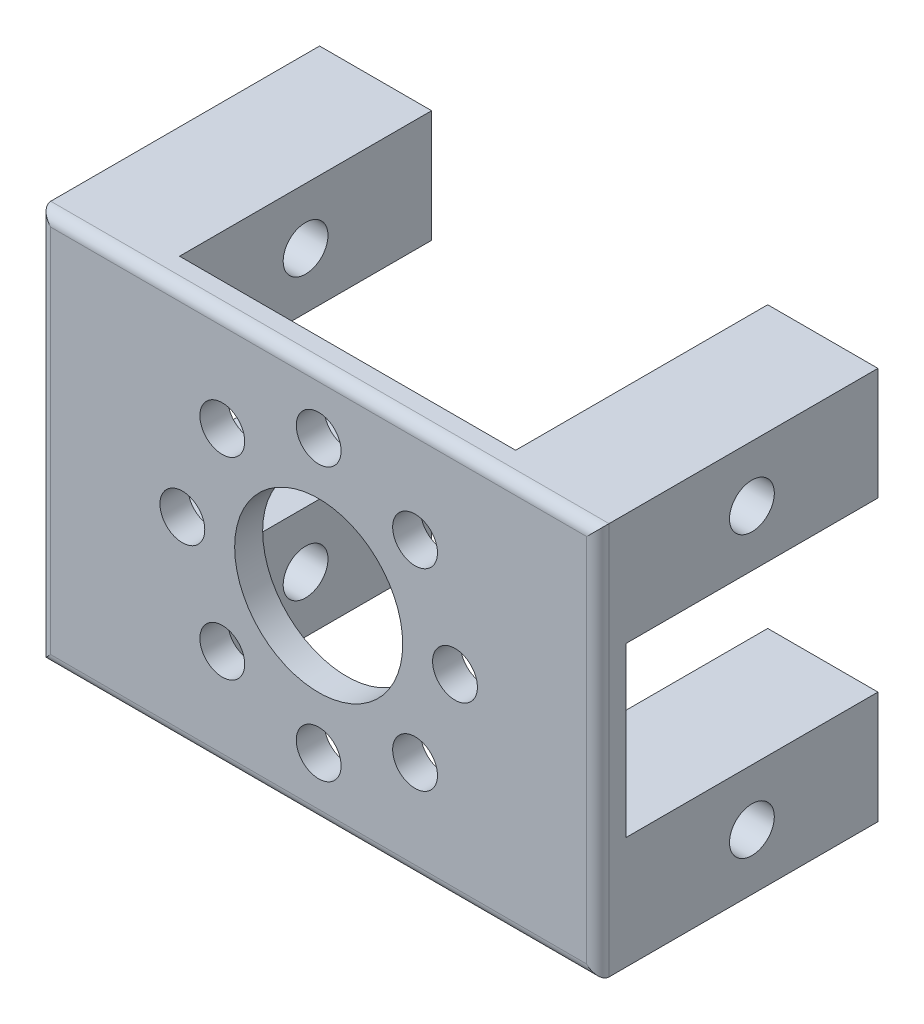
ISO-10303-21;
HEADER;
FILE_DESCRIPTION(('STEP AP214'),'2;1');
FILE_NAME('part.step','',(''),(''),'','','');
FILE_SCHEMA(('AUTOMOTIVE_DESIGN { 1 0 10303 214 1 1 1 1 }'));
ENDSEC;
DATA;
#1=APPLICATION_CONTEXT('core data for automotive mechanical design processes');
#2=APPLICATION_PROTOCOL_DEFINITION('international standard','automotive_design',2000,#1);
#3=PRODUCT_CONTEXT('',#1,'mechanical');
#4=PRODUCT('Part','Part','',(#3));
#5=PRODUCT_RELATED_PRODUCT_CATEGORY('part','',(#4));
#6=PRODUCT_DEFINITION_FORMATION('','',#4);
#7=PRODUCT_DEFINITION_CONTEXT('part definition',#1,'design');
#8=PRODUCT_DEFINITION('design','',#6,#7);
#9=PRODUCT_DEFINITION_SHAPE('','',#8);
#10=(LENGTH_UNIT() NAMED_UNIT(*) SI_UNIT(.MILLI.,.METRE.));
#11=(NAMED_UNIT(*) PLANE_ANGLE_UNIT() SI_UNIT($,.RADIAN.));
#12=(NAMED_UNIT(*) SI_UNIT($,.STERADIAN.) SOLID_ANGLE_UNIT());
#13=UNCERTAINTY_MEASURE_WITH_UNIT(LENGTH_MEASURE(1.E-05),#10,'distance_accuracy_value','');
#14=(GEOMETRIC_REPRESENTATION_CONTEXT(3) GLOBAL_UNCERTAINTY_ASSIGNED_CONTEXT((#13)) GLOBAL_UNIT_ASSIGNED_CONTEXT((#10,
#11,#12)) REPRESENTATION_CONTEXT('',''));
#15=CARTESIAN_POINT('',(0.,0.,0.));
#16=DIRECTION('',(0.,0.,1.));
#17=DIRECTION('',(1.,0.,0.));
#18=AXIS2_PLACEMENT_3D('',#15,#16,#17);
#19=CARTESIAN_POINT('',(0.,0.,0.));
#20=DIRECTION('',(0.,0.,-1.));
#21=DIRECTION('',(-1.,0.,0.));
#22=AXIS2_PLACEMENT_3D('',#19,#20,#21);
#23=PLANE('',#22);
#24=DIRECTION('',(1.,0.,0.));
#25=VECTOR('',#24,1.);
#26=CARTESIAN_POINT('',(-49.8392242774798,-15.,0.));
#27=LINE('',#26,#25);
#28=CARTESIAN_POINT('',(30.1607757225202,-15.,0.));
#29=VERTEX_POINT('',#28);
#30=CARTESIAN_POINT('',(49.8392242774798,-15.,0.));
#31=VERTEX_POINT('',#30);
#32=EDGE_CURVE('E168',#29,#31,#27,.T.);
#33=ORIENTED_EDGE('',*,*,#32,.T.);
#34=DIRECTION('',(0.,1.,0.));
#35=VECTOR('',#34,1.);
#36=CARTESIAN_POINT('',(49.8392242774798,-35.0450845481055,0.));
#37=LINE('',#36,#35);
#38=CARTESIAN_POINT('',(49.8392242774798,-35.0450845481055,0.));
#39=VERTEX_POINT('',#38);
#40=EDGE_CURVE('E184',#39,#31,#37,.T.);
#41=ORIENTED_EDGE('',*,*,#40,.F.);
#42=DIRECTION('',(1.,0.,0.));
#43=VECTOR('',#42,1.);
#44=CARTESIAN_POINT('',(-49.8392242774798,-35.0450845481055,0.));
#45=LINE('',#44,#43);
#46=CARTESIAN_POINT('',(30.1607757225202,-35.0450845481055,0.));
#47=VERTEX_POINT('',#46);
#48=EDGE_CURVE('E216',#47,#39,#45,.T.);
#49=ORIENTED_EDGE('',*,*,#48,.F.);
#50=DIRECTION('',(0.,1.,0.));
#51=VECTOR('',#50,1.);
#52=CARTESIAN_POINT('',(30.1607757225202,-35.0450845481055,0.));
#53=LINE('',#52,#51);
#54=EDGE_CURVE('E185',#47,#29,#53,.T.);
#55=ORIENTED_EDGE('',*,*,#54,.T.);
#56=EDGE_LOOP('',(#33,#41,#49,#55));
#57=FACE_BOUND('',#56,.T.);
#58=ADVANCED_FACE('F39',(#57),#23,.T.);
#59=CARTESIAN_POINT('',(-49.8392242774798,-15.,0.));
#60=VERTEX_POINT('',#59);
#61=CARTESIAN_POINT('',(-29.8392242774798,-15.,0.));
#62=VERTEX_POINT('',#61);
#63=EDGE_CURVE('E187',#60,#62,#27,.T.);
#64=ORIENTED_EDGE('',*,*,#63,.T.);
#65=DIRECTION('',(0.,1.,0.));
#66=VECTOR('',#65,1.);
#67=CARTESIAN_POINT('',(-29.8392242774798,-35.0450845481055,0.));
#68=LINE('',#67,#66);
#69=CARTESIAN_POINT('',(-29.8392242774798,-35.0450845481055,0.));
#70=VERTEX_POINT('',#69);
#71=EDGE_CURVE('E378',#70,#62,#68,.T.);
#72=ORIENTED_EDGE('',*,*,#71,.F.);
#73=CARTESIAN_POINT('',(-49.8392242774798,-35.0450845481055,0.));
#74=VERTEX_POINT('',#73);
#75=EDGE_CURVE('E217',#74,#70,#45,.T.);
#76=ORIENTED_EDGE('',*,*,#75,.F.);
#77=DIRECTION('',(0.,-1.,0.));
#78=VECTOR('',#77,1.);
#79=CARTESIAN_POINT('',(-49.8392242774798,-35.0450845481055,0.));
#80=LINE('',#79,#78);
#81=EDGE_CURVE('E211',#60,#74,#80,.T.);
#82=ORIENTED_EDGE('',*,*,#81,.F.);
#83=EDGE_LOOP('',(#64,#72,#76,#82));
#84=FACE_BOUND('',#83,.T.);
#85=ADVANCED_FACE('F499',(#84),#23,.T.);
#86=CARTESIAN_POINT('',(-29.8392242774798,-35.0450845481055,0.));
#87=DIRECTION('',(-1.,0.,0.));
#88=DIRECTION('',(0.,0.,1.));
#89=AXIS2_PLACEMENT_3D('',#86,#87,#88);
#90=PLANE('',#89);
#91=CARTESIAN_POINT('',(-29.8392242774798,-25.0225422740527,22.5));
#92=DIRECTION('',(-1.,0.,0.));
#93=DIRECTION('',(0.,0.,1.));
#94=AXIS2_PLACEMENT_3D('',#91,#92,#93);
#95=CIRCLE('',#94,4.);
#96=CARTESIAN_POINT('',(-29.8392242774798,-25.0225422740527,26.5));
#97=VERTEX_POINT('',#96);
#98=EDGE_CURVE('E178',#97,#97,#95,.T.);
#99=ORIENTED_EDGE('',*,*,#98,.T.);
#100=EDGE_LOOP('',(#99));
#101=FACE_BOUND('',#100,.T.);
#102=ORIENTED_EDGE('',*,*,#71,.T.);
#103=DIRECTION('',(0.,0.,1.));
#104=VECTOR('',#103,1.);
#105=CARTESIAN_POINT('',(-29.8392242774798,-15.,0.));
#106=LINE('',#105,#104);
#107=CARTESIAN_POINT('',(-29.8392242774798,-15.,45.));
#108=VERTEX_POINT('',#107);
#109=EDGE_CURVE('E346',#62,#108,#106,.T.);
#110=ORIENTED_EDGE('',*,*,#109,.T.);
#111=DIRECTION('',(0.,1.,0.));
#112=VECTOR('',#111,1.);
#113=CARTESIAN_POINT('',(-29.8392242774798,-35.0450845481055,45.));
#114=LINE('',#113,#112);
#115=CARTESIAN_POINT('',(-29.8392242774798,-35.0450845481055,45.));
#116=VERTEX_POINT('',#115);
#117=EDGE_CURVE('E238',#116,#108,#114,.T.);
#118=ORIENTED_EDGE('',*,*,#117,.F.);
#119=DIRECTION('',(0.,0.,1.));
#120=VECTOR('',#119,1.);
#121=CARTESIAN_POINT('',(-29.8392242774798,-35.0450845481055,0.));
#122=LINE('',#121,#120);
#123=EDGE_CURVE('E369',#70,#116,#122,.T.);
#124=ORIENTED_EDGE('',*,*,#123,.F.);
#125=EDGE_LOOP('',(#102,#110,#118,#124));
#126=FACE_BOUND('',#125,.T.);
#127=ADVANCED_FACE('F504',(#101,#126),#90,.F.);
#128=CARTESIAN_POINT('',(30.1607757225202,-35.0450845481055,0.));
#129=DIRECTION('',(-1.,0.,0.));
#130=DIRECTION('',(0.,0.,1.));
#131=AXIS2_PLACEMENT_3D('',#128,#129,#130);
#132=PLANE('',#131);
#133=CARTESIAN_POINT('',(30.1607757225202,-25.0225422740527,22.5));
#134=DIRECTION('',(-1.,0.,0.));
#135=DIRECTION('',(0.,0.,1.));
#136=AXIS2_PLACEMENT_3D('',#133,#134,#135);
#137=CIRCLE('',#136,4.);
#138=CARTESIAN_POINT('',(30.1607757225202,-25.0225422740527,26.5));
#139=VERTEX_POINT('',#138);
#140=EDGE_CURVE('E304',#139,#139,#137,.T.);
#141=ORIENTED_EDGE('',*,*,#140,.F.);
#142=EDGE_LOOP('',(#141));
#143=FACE_BOUND('',#142,.T.);
#144=DIRECTION('',(0.,0.,1.));
#145=VECTOR('',#144,1.);
#146=CARTESIAN_POINT('',(30.1607757225202,-15.,0.));
#147=LINE('',#146,#145);
#148=CARTESIAN_POINT('',(30.1607757225202,-15.,45.));
#149=VERTEX_POINT('',#148);
#150=EDGE_CURVE('E241',#29,#149,#147,.T.);
#151=ORIENTED_EDGE('',*,*,#150,.F.);
#152=ORIENTED_EDGE('',*,*,#54,.F.);
#153=DIRECTION('',(0.,0.,1.));
#154=VECTOR('',#153,1.);
#155=CARTESIAN_POINT('',(30.1607757225202,-35.0450845481055,0.));
#156=LINE('',#155,#154);
#157=CARTESIAN_POINT('',(30.1607757225202,-35.0450845481055,45.));
#158=VERTEX_POINT('',#157);
#159=EDGE_CURVE('E366',#47,#158,#156,.T.);
#160=ORIENTED_EDGE('',*,*,#159,.T.);
#161=DIRECTION('',(0.,1.,0.));
#162=VECTOR('',#161,1.);
#163=CARTESIAN_POINT('',(30.1607757225202,-35.0450845481055,45.));
#164=LINE('',#163,#162);
#165=EDGE_CURVE('E386',#158,#149,#164,.T.);
#166=ORIENTED_EDGE('',*,*,#165,.T.);
#167=EDGE_LOOP('',(#151,#152,#160,#166));
#168=FACE_BOUND('',#167,.T.);
#169=ADVANCED_FACE('F517',(#143,#168),#132,.T.);
#170=DIRECTION('',(1.,0.,0.));
#171=VECTOR('',#170,1.);
#172=CARTESIAN_POINT('',(-49.8392242774798,15.,0.));
#173=LINE('',#172,#171);
#174=CARTESIAN_POINT('',(30.1607757225202,15.,0.));
#175=VERTEX_POINT('',#174);
#176=CARTESIAN_POINT('',(49.8392242774798,15.,0.));
#177=VERTEX_POINT('',#176);
#178=EDGE_CURVE('E339',#175,#177,#173,.T.);
#179=ORIENTED_EDGE('',*,*,#178,.F.);
#180=CARTESIAN_POINT('',(30.1607757225202,35.0450845481055,0.));
#181=VERTEX_POINT('',#180);
#182=EDGE_CURVE('E385',#175,#181,#53,.T.);
#183=ORIENTED_EDGE('',*,*,#182,.T.);
#184=DIRECTION('',(-1.,0.,0.));
#185=VECTOR('',#184,1.);
#186=CARTESIAN_POINT('',(-49.8392242774798,35.0450845481055,0.));
#187=LINE('',#186,#185);
#188=CARTESIAN_POINT('',(49.8392242774798,35.0450845481055,0.));
#189=VERTEX_POINT('',#188);
#190=EDGE_CURVE('E202',#189,#181,#187,.T.);
#191=ORIENTED_EDGE('',*,*,#190,.F.);
#192=EDGE_CURVE('E197',#177,#189,#37,.T.);
#193=ORIENTED_EDGE('',*,*,#192,.F.);
#194=EDGE_LOOP('',(#179,#183,#191,#193));
#195=FACE_BOUND('',#194,.T.);
#196=ADVANCED_FACE('F463',(#195),#23,.T.);
#197=CARTESIAN_POINT('',(0.,0.,50.));
#198=DIRECTION('',(0.,0.,-1.));
#199=DIRECTION('',(-1.,0.,0.));
#200=AXIS2_PLACEMENT_3D('',#197,#198,#199);
#201=PLANE('',#200);
#202=DIRECTION('',(1.,0.,0.));
#203=VECTOR('',#202,1.);
#204=CARTESIAN_POINT('',(0.,-33.0450845481055,50.));
#205=LINE('',#204,#203);
#206=CARTESIAN_POINT('',(-47.8392242774798,-33.0450845481055,50.));
#207=VERTEX_POINT('',#206);
#208=CARTESIAN_POINT('',(47.8392242774798,-33.0450845481055,50.));
#209=VERTEX_POINT('',#208);
#210=EDGE_CURVE('E256',#207,#209,#205,.T.);
#211=ORIENTED_EDGE('',*,*,#210,.T.);
#212=DIRECTION('',(0.,1.,0.));
#213=VECTOR('',#212,1.);
#214=CARTESIAN_POINT('',(47.8392242774798,0.,50.));
#215=LINE('',#214,#213);
#216=CARTESIAN_POINT('',(47.8392242774798,33.0450845481055,50.));
#217=VERTEX_POINT('',#216);
#218=EDGE_CURVE('E259',#209,#217,#215,.T.);
#219=ORIENTED_EDGE('',*,*,#218,.T.);
#220=DIRECTION('',(-1.,0.,0.));
#221=VECTOR('',#220,1.);
#222=CARTESIAN_POINT('',(0.,33.0450845481055,50.));
#223=LINE('',#222,#221);
#224=CARTESIAN_POINT('',(-47.8392242774798,33.0450845481055,50.));
#225=VERTEX_POINT('',#224);
#226=EDGE_CURVE('E244',#217,#225,#223,.T.);
#227=ORIENTED_EDGE('',*,*,#226,.T.);
#228=DIRECTION('',(0.,-1.,0.));
#229=VECTOR('',#228,1.);
#230=CARTESIAN_POINT('',(-47.8392242774798,0.,50.));
#231=LINE('',#230,#229);
#232=EDGE_CURVE('E253',#225,#207,#231,.T.);
#233=ORIENTED_EDGE('',*,*,#232,.T.);
#234=EDGE_LOOP('',(#211,#219,#227,#233));
#235=FACE_BOUND('',#234,.T.);
#236=CARTESIAN_POINT('',(0.,0.,50.));
#237=DIRECTION('',(0.,0.,1.));
#238=DIRECTION('',(1.,0.,0.));
#239=AXIS2_PLACEMENT_3D('',#236,#237,#238);
#240=CIRCLE('',#239,15.);
#241=CARTESIAN_POINT('',(15.,0.,50.));
#242=VERTEX_POINT('',#241);
#243=EDGE_CURVE('E205',#242,#242,#240,.T.);
#244=ORIENTED_EDGE('',*,*,#243,.F.);
#245=EDGE_LOOP('',(#244));
#246=FACE_BOUND('',#245,.T.);
#247=CARTESIAN_POINT('',(24.3350700799044,0.,50.));
#248=DIRECTION('',(0.,0.,1.));
#249=DIRECTION('',(1.,0.,0.));
#250=AXIS2_PLACEMENT_3D('',#247,#248,#249);
#251=CIRCLE('',#250,4.);
#252=CARTESIAN_POINT('',(28.3350700799044,0.,50.));
#253=VERTEX_POINT('',#252);
#254=EDGE_CURVE('E448',#253,#253,#251,.T.);
#255=ORIENTED_EDGE('',*,*,#254,.F.);
#256=EDGE_LOOP('',(#255));
#257=FACE_BOUND('',#256,.T.);
#258=CARTESIAN_POINT('',(17.2074930741502,-17.2074930741503,50.));
#259=DIRECTION('',(0.,0.,1.));
#260=DIRECTION('',(1.,0.,0.));
#261=AXIS2_PLACEMENT_3D('',#258,#259,#260);
#262=CIRCLE('',#261,4.);
#263=CARTESIAN_POINT('',(21.2074930741502,-17.2074930741503,50.));
#264=VERTEX_POINT('',#263);
#265=EDGE_CURVE('E445',#264,#264,#262,.T.);
#266=ORIENTED_EDGE('',*,*,#265,.F.);
#267=EDGE_LOOP('',(#266));
#268=FACE_BOUND('',#267,.T.);
#269=CARTESIAN_POINT('',(0.,-24.3350700799044,50.));
#270=DIRECTION('',(0.,0.,1.));
#271=DIRECTION('',(1.,0.,0.));
#272=AXIS2_PLACEMENT_3D('',#269,#270,#271);
#273=CIRCLE('',#272,4.);
#274=CARTESIAN_POINT('',(3.99999999999991,-24.3350700799044,50.));
#275=VERTEX_POINT('',#274);
#276=EDGE_CURVE('E441',#275,#275,#273,.T.);
#277=ORIENTED_EDGE('',*,*,#276,.F.);
#278=EDGE_LOOP('',(#277));
#279=FACE_BOUND('',#278,.T.);
#280=CARTESIAN_POINT('',(-17.2074930741504,-17.2074930741502,50.));
#281=DIRECTION('',(0.,0.,1.));
#282=DIRECTION('',(1.,0.,0.));
#283=AXIS2_PLACEMENT_3D('',#280,#281,#282);
#284=CIRCLE('',#283,4.);
#285=CARTESIAN_POINT('',(-13.2074930741504,-17.2074930741502,50.));
#286=VERTEX_POINT('',#285);
#287=EDGE_CURVE('E437',#286,#286,#284,.T.);
#288=ORIENTED_EDGE('',*,*,#287,.F.);
#289=EDGE_LOOP('',(#288));
#290=FACE_BOUND('',#289,.T.);
#291=CARTESIAN_POINT('',(-24.3350700799044,1.7686978003076E-13,50.));
#292=DIRECTION('',(0.,0.,1.));
#293=DIRECTION('',(1.,0.,0.));
#294=AXIS2_PLACEMENT_3D('',#291,#292,#293);
#295=CIRCLE('',#294,4.);
#296=CARTESIAN_POINT('',(-20.3350700799044,1.7686978003076E-13,50.));
#297=VERTEX_POINT('',#296);
#298=EDGE_CURVE('E433',#297,#297,#295,.T.);
#299=ORIENTED_EDGE('',*,*,#298,.F.);
#300=EDGE_LOOP('',(#299));
#301=FACE_BOUND('',#300,.T.);
#302=CARTESIAN_POINT('',(-17.2074930741501,17.2074930741504,50.));
#303=DIRECTION('',(0.,0.,1.));
#304=DIRECTION('',(1.,0.,0.));
#305=AXIS2_PLACEMENT_3D('',#302,#303,#304);
#306=CIRCLE('',#305,4.);
#307=CARTESIAN_POINT('',(-13.2074930741501,17.2074930741504,50.));
#308=VERTEX_POINT('',#307);
#309=EDGE_CURVE('E429',#308,#308,#306,.T.);
#310=ORIENTED_EDGE('',*,*,#309,.F.);
#311=EDGE_LOOP('',(#310));
#312=FACE_BOUND('',#311,.T.);
#313=CARTESIAN_POINT('',(2.61835223094186E-13,24.3350700799044,50.));
#314=DIRECTION('',(0.,0.,1.));
#315=DIRECTION('',(1.,0.,0.));
#316=AXIS2_PLACEMENT_3D('',#313,#314,#315);
#317=CIRCLE('',#316,4.);
#318=CARTESIAN_POINT('',(4.00000000000026,24.3350700799044,50.));
#319=VERTEX_POINT('',#318);
#320=EDGE_CURVE('E425',#319,#319,#317,.T.);
#321=ORIENTED_EDGE('',*,*,#320,.F.);
#322=EDGE_LOOP('',(#321));
#323=FACE_BOUND('',#322,.T.);
#324=CARTESIAN_POINT('',(17.2074930741505,17.2074930741501,50.));
#325=DIRECTION('',(0.,0.,1.));
#326=DIRECTION('',(1.,0.,0.));
#327=AXIS2_PLACEMENT_3D('',#324,#325,#326);
#328=CIRCLE('',#327,4.);
#329=CARTESIAN_POINT('',(21.2074930741505,17.2074930741501,50.));
#330=VERTEX_POINT('',#329);
#331=EDGE_CURVE('E421',#330,#330,#328,.T.);
#332=ORIENTED_EDGE('',*,*,#331,.F.);
#333=EDGE_LOOP('',(#332));
#334=FACE_BOUND('',#333,.T.);
#335=ADVANCED_FACE('F459',(#235,#246,#257,#268,#279,#290,#301,#312,#323,#334),#201,.F.);
#336=CARTESIAN_POINT('',(-49.8392242774798,15.,0.));
#337=VERTEX_POINT('',#336);
#338=CARTESIAN_POINT('',(-29.8392242774798,15.,0.));
#339=VERTEX_POINT('',#338);
#340=EDGE_CURVE('E337',#337,#339,#173,.T.);
#341=ORIENTED_EDGE('',*,*,#340,.F.);
#342=CARTESIAN_POINT('',(-49.8392242774798,35.0450845481055,0.));
#343=VERTEX_POINT('',#342);
#344=EDGE_CURVE('E212',#343,#337,#80,.T.);
#345=ORIENTED_EDGE('',*,*,#344,.F.);
#346=CARTESIAN_POINT('',(-29.8392242774798,35.0450845481055,0.));
#347=VERTEX_POINT('',#346);
#348=EDGE_CURVE('E196',#347,#343,#187,.T.);
#349=ORIENTED_EDGE('',*,*,#348,.F.);
#350=EDGE_CURVE('E382',#339,#347,#68,.T.);
#351=ORIENTED_EDGE('',*,*,#350,.F.);
#352=EDGE_LOOP('',(#341,#345,#349,#351));
#353=FACE_BOUND('',#352,.T.);
#354=ADVANCED_FACE('F462',(#353),#23,.T.);
#355=CARTESIAN_POINT('',(49.8392242774798,-35.0450845481055,50.));
#356=DIRECTION('',(-1.,0.,0.));
#357=DIRECTION('',(0.,0.,1.));
#358=AXIS2_PLACEMENT_3D('',#355,#356,#357);
#359=PLANE('',#358);
#360=CARTESIAN_POINT('',(49.8392242774798,-25.0225422740527,22.5));
#361=DIRECTION('',(1.,0.,0.));
#362=DIRECTION('',(0.,0.,-1.));
#363=AXIS2_PLACEMENT_3D('',#360,#361,#362);
#364=CIRCLE('',#363,4.);
#365=CARTESIAN_POINT('',(49.8392242774798,-25.0225422740527,18.5));
#366=VERTEX_POINT('',#365);
#367=EDGE_CURVE('E296',#366,#366,#364,.T.);
#368=ORIENTED_EDGE('',*,*,#367,.F.);
#369=EDGE_LOOP('',(#368));
#370=FACE_BOUND('',#369,.T.);
#371=CARTESIAN_POINT('',(49.8392242774798,25.0225422740527,22.5));
#372=DIRECTION('',(1.,0.,0.));
#373=DIRECTION('',(0.,0.,1.));
#374=AXIS2_PLACEMENT_3D('',#371,#372,#373);
#375=CIRCLE('',#374,4.);
#376=CARTESIAN_POINT('',(49.8392242774798,25.0225422740527,26.5));
#377=VERTEX_POINT('',#376);
#378=EDGE_CURVE('E284',#377,#377,#375,.T.);
#379=ORIENTED_EDGE('',*,*,#378,.F.);
#380=EDGE_LOOP('',(#379));
#381=FACE_BOUND('',#380,.T.);
#382=DIRECTION('',(0.,0.,-1.));
#383=VECTOR('',#382,1.);
#384=CARTESIAN_POINT('',(49.8392242774798,35.0450845481055,50.));
#385=LINE('',#384,#383);
#386=CARTESIAN_POINT('',(49.8392242774798,35.0450845481055,48.));
#387=VERTEX_POINT('',#386);
#388=EDGE_CURVE('E229',#387,#189,#385,.T.);
#389=ORIENTED_EDGE('',*,*,#388,.F.);
#390=DIRECTION('',(0.,1.,0.));
#391=VECTOR('',#390,1.);
#392=CARTESIAN_POINT('',(49.8392242774798,-35.0450845481055,48.));
#393=LINE('',#392,#391);
#394=CARTESIAN_POINT('',(49.8392242774798,-35.0450845481055,48.));
#395=VERTEX_POINT('',#394);
#396=EDGE_CURVE('E263',#387,#395,#393,.F.);
#397=ORIENTED_EDGE('',*,*,#396,.T.);
#398=DIRECTION('',(0.,0.,-1.));
#399=VECTOR('',#398,1.);
#400=CARTESIAN_POINT('',(49.8392242774798,-35.0450845481055,50.));
#401=LINE('',#400,#399);
#402=EDGE_CURVE('E193',#395,#39,#401,.T.);
#403=ORIENTED_EDGE('',*,*,#402,.T.);
#404=ORIENTED_EDGE('',*,*,#40,.T.);
#405=DIRECTION('',(0.,0.,-1.));
#406=VECTOR('',#405,1.);
#407=CARTESIAN_POINT('',(49.8392242774798,-15.,45.));
#408=LINE('',#407,#406);
#409=CARTESIAN_POINT('',(49.8392242774798,-15.,45.));
#410=VERTEX_POINT('',#409);
#411=EDGE_CURVE('E165',#410,#31,#408,.T.);
#412=ORIENTED_EDGE('',*,*,#411,.F.);
#413=DIRECTION('',(0.,-1.,0.));
#414=VECTOR('',#413,1.);
#415=CARTESIAN_POINT('',(49.8392242774798,15.,45.));
#416=LINE('',#415,#414);
#417=CARTESIAN_POINT('',(49.8392242774798,15.,45.));
#418=VERTEX_POINT('',#417);
#419=EDGE_CURVE('E314',#418,#410,#416,.T.);
#420=ORIENTED_EDGE('',*,*,#419,.F.);
#421=DIRECTION('',(0.,0.,1.));
#422=VECTOR('',#421,1.);
#423=CARTESIAN_POINT('',(49.8392242774798,15.,0.));
#424=LINE('',#423,#422);
#425=EDGE_CURVE('E177',#177,#418,#424,.T.);
#426=ORIENTED_EDGE('',*,*,#425,.F.);
#427=ORIENTED_EDGE('',*,*,#192,.T.);
#428=EDGE_LOOP('',(#389,#397,#403,#404,#412,#420,#426,#427));
#429=FACE_BOUND('',#428,.T.);
#430=ADVANCED_FACE('F191',(#370,#381,#429),#359,.F.);
#431=CARTESIAN_POINT('',(-49.8392242774798,35.0450845481055,50.));
#432=DIRECTION('',(0.,-1.,0.));
#433=DIRECTION('',(0.,0.,-1.));
#434=AXIS2_PLACEMENT_3D('',#431,#432,#433);
#435=PLANE('',#434);
#436=DIRECTION('',(0.,0.,-1.));
#437=VECTOR('',#436,1.);
#438=CARTESIAN_POINT('',(-49.8392242774798,35.0450845481055,50.));
#439=LINE('',#438,#437);
#440=CARTESIAN_POINT('',(-49.8392242774798,35.0450845481055,48.));
#441=VERTEX_POINT('',#440);
#442=EDGE_CURVE('E226',#441,#343,#439,.T.);
#443=ORIENTED_EDGE('',*,*,#442,.F.);
#444=DIRECTION('',(-1.,0.,0.));
#445=VECTOR('',#444,1.);
#446=CARTESIAN_POINT('',(-49.8392242774798,35.0450845481055,48.));
#447=LINE('',#446,#445);
#448=EDGE_CURVE('E11',#441,#387,#447,.F.);
#449=ORIENTED_EDGE('',*,*,#448,.T.);
#450=ORIENTED_EDGE('',*,*,#388,.T.);
#451=ORIENTED_EDGE('',*,*,#190,.T.);
#452=DIRECTION('',(0.,0.,1.));
#453=VECTOR('',#452,1.);
#454=CARTESIAN_POINT('',(30.1607757225202,35.0450845481055,0.));
#455=LINE('',#454,#453);
#456=CARTESIAN_POINT('',(30.1607757225202,35.0450845481055,45.));
#457=VERTEX_POINT('',#456);
#458=EDGE_CURVE('E354',#181,#457,#455,.T.);
#459=ORIENTED_EDGE('',*,*,#458,.T.);
#460=DIRECTION('',(1.,0.,0.));
#461=VECTOR('',#460,1.);
#462=CARTESIAN_POINT('',(-29.8392242774798,35.0450845481055,45.));
#463=LINE('',#462,#461);
#464=CARTESIAN_POINT('',(-29.8392242774798,35.0450845481055,45.));
#465=VERTEX_POINT('',#464);
#466=EDGE_CURVE('E350',#465,#457,#463,.T.);
#467=ORIENTED_EDGE('',*,*,#466,.F.);
#468=DIRECTION('',(0.,0.,1.));
#469=VECTOR('',#468,1.);
#470=CARTESIAN_POINT('',(-29.8392242774798,35.0450845481055,0.));
#471=LINE('',#470,#469);
#472=EDGE_CURVE('E358',#347,#465,#471,.T.);
#473=ORIENTED_EDGE('',*,*,#472,.F.);
#474=ORIENTED_EDGE('',*,*,#348,.T.);
#475=EDGE_LOOP('',(#443,#449,#450,#451,#459,#467,#473,#474));
#476=FACE_BOUND('',#475,.T.);
#477=ADVANCED_FACE('F512',(#476),#435,.F.);
#478=CARTESIAN_POINT('',(-49.8392242774798,-35.0450845481055,50.));
#479=DIRECTION('',(1.,0.,0.));
#480=DIRECTION('',(0.,0.,-1.));
#481=AXIS2_PLACEMENT_3D('',#478,#479,#480);
#482=PLANE('',#481);
#483=CARTESIAN_POINT('',(-49.8392242774798,-25.0225422740527,22.5));
#484=DIRECTION('',(1.,0.,0.));
#485=DIRECTION('',(0.,0.,-1.));
#486=AXIS2_PLACEMENT_3D('',#483,#484,#485);
#487=CIRCLE('',#486,4.);
#488=CARTESIAN_POINT('',(-49.8392242774798,-25.0225422740527,18.5));
#489=VERTEX_POINT('',#488);
#490=EDGE_CURVE('E250',#489,#489,#487,.T.);
#491=ORIENTED_EDGE('',*,*,#490,.T.);
#492=EDGE_LOOP('',(#491));
#493=FACE_BOUND('',#492,.T.);
#494=CARTESIAN_POINT('',(-49.8392242774798,25.0225422740527,22.5));
#495=DIRECTION('',(1.,0.,0.));
#496=DIRECTION('',(0.,0.,1.));
#497=AXIS2_PLACEMENT_3D('',#494,#495,#496);
#498=CIRCLE('',#497,4.);
#499=CARTESIAN_POINT('',(-49.8392242774798,25.0225422740527,26.5));
#500=VERTEX_POINT('',#499);
#501=EDGE_CURVE('E290',#500,#500,#498,.T.);
#502=ORIENTED_EDGE('',*,*,#501,.T.);
#503=EDGE_LOOP('',(#502));
#504=FACE_BOUND('',#503,.T.);
#505=DIRECTION('',(0.,0.,-1.));
#506=VECTOR('',#505,1.);
#507=CARTESIAN_POINT('',(-49.8392242774798,-35.0450845481055,50.));
#508=LINE('',#507,#506);
#509=CARTESIAN_POINT('',(-49.8392242774798,-35.0450845481055,48.));
#510=VERTEX_POINT('',#509);
#511=EDGE_CURVE('E223',#510,#74,#508,.T.);
#512=ORIENTED_EDGE('',*,*,#511,.F.);
#513=DIRECTION('',(0.,-1.,0.));
#514=VECTOR('',#513,1.);
#515=CARTESIAN_POINT('',(-49.8392242774798,-35.0450845481055,48.));
#516=LINE('',#515,#514);
#517=EDGE_CURVE('E49',#510,#441,#516,.F.);
#518=ORIENTED_EDGE('',*,*,#517,.T.);
#519=ORIENTED_EDGE('',*,*,#442,.T.);
#520=ORIENTED_EDGE('',*,*,#344,.T.);
#521=DIRECTION('',(0.,0.,1.));
#522=VECTOR('',#521,1.);
#523=CARTESIAN_POINT('',(-49.8392242774798,15.,0.));
#524=LINE('',#523,#522);
#525=CARTESIAN_POINT('',(-49.8392242774798,15.,45.));
#526=VERTEX_POINT('',#525);
#527=EDGE_CURVE('E321',#337,#526,#524,.T.);
#528=ORIENTED_EDGE('',*,*,#527,.T.);
#529=DIRECTION('',(0.,-1.,0.));
#530=VECTOR('',#529,1.);
#531=CARTESIAN_POINT('',(-49.8392242774798,15.,45.));
#532=LINE('',#531,#530);
#533=CARTESIAN_POINT('',(-49.8392242774798,-15.,45.));
#534=VERTEX_POINT('',#533);
#535=EDGE_CURVE('E188',#526,#534,#532,.T.);
#536=ORIENTED_EDGE('',*,*,#535,.T.);
#537=DIRECTION('',(0.,0.,-1.));
#538=VECTOR('',#537,1.);
#539=CARTESIAN_POINT('',(-49.8392242774798,-15.,45.));
#540=LINE('',#539,#538);
#541=EDGE_CURVE('E317',#534,#60,#540,.T.);
#542=ORIENTED_EDGE('',*,*,#541,.T.);
#543=ORIENTED_EDGE('',*,*,#81,.T.);
#544=EDGE_LOOP('',(#512,#518,#519,#520,#528,#536,#542,#543));
#545=FACE_BOUND('',#544,.T.);
#546=ADVANCED_FACE('F645',(#493,#504,#545),#482,.F.);
#547=CARTESIAN_POINT('',(-49.8392242774798,-35.0450845481055,50.));
#548=DIRECTION('',(0.,1.,0.));
#549=DIRECTION('',(0.,0.,1.));
#550=AXIS2_PLACEMENT_3D('',#547,#548,#549);
#551=PLANE('',#550);
#552=ORIENTED_EDGE('',*,*,#402,.F.);
#553=DIRECTION('',(1.,0.,0.));
#554=VECTOR('',#553,1.);
#555=CARTESIAN_POINT('',(-49.8392242774798,-35.0450845481055,48.));
#556=LINE('',#555,#554);
#557=EDGE_CURVE('E64',#395,#510,#556,.F.);
#558=ORIENTED_EDGE('',*,*,#557,.T.);
#559=ORIENTED_EDGE('',*,*,#511,.T.);
#560=ORIENTED_EDGE('',*,*,#75,.T.);
#561=ORIENTED_EDGE('',*,*,#123,.T.);
#562=DIRECTION('',(1.,0.,0.));
#563=VECTOR('',#562,1.);
#564=CARTESIAN_POINT('',(-29.8392242774798,-35.0450845481055,45.));
#565=LINE('',#564,#563);
#566=EDGE_CURVE('E362',#116,#158,#565,.T.);
#567=ORIENTED_EDGE('',*,*,#566,.T.);
#568=ORIENTED_EDGE('',*,*,#159,.F.);
#569=ORIENTED_EDGE('',*,*,#48,.T.);
#570=EDGE_LOOP('',(#552,#558,#559,#560,#561,#567,#568,#569));
#571=FACE_BOUND('',#570,.T.);
#572=ADVANCED_FACE('F655',(#571),#551,.F.);
#573=CARTESIAN_POINT('',(0.,0.,50.));
#574=DIRECTION('',(0.,0.,-1.));
#575=DIRECTION('',(-1.,0.,0.));
#576=AXIS2_PLACEMENT_3D('',#573,#574,#575);
#577=CYLINDRICAL_SURFACE('',#576,15.);
#578=CARTESIAN_POINT('',(0.,0.,45.));
#579=DIRECTION('',(0.,0.,1.));
#580=DIRECTION('',(1.,0.,0.));
#581=AXIS2_PLACEMENT_3D('',#578,#579,#580);
#582=CIRCLE('',#581,15.);
#583=CARTESIAN_POINT('',(15.,0.,45.));
#584=VERTEX_POINT('',#583);
#585=EDGE_CURVE('E417',#584,#584,#582,.T.);
#586=ORIENTED_EDGE('',*,*,#585,.F.);
#587=EDGE_LOOP('',(#586));
#588=FACE_BOUND('',#587,.T.);
#589=ORIENTED_EDGE('',*,*,#243,.T.);
#590=EDGE_LOOP('',(#589));
#591=FACE_BOUND('',#590,.T.);
#592=ADVANCED_FACE('F457',(#588,#591),#577,.F.);
#593=CARTESIAN_POINT('',(24.3350700799044,0.,50.));
#594=DIRECTION('',(0.,0.,-1.));
#595=DIRECTION('',(-1.,0.,0.));
#596=AXIS2_PLACEMENT_3D('',#593,#594,#595);
#597=CYLINDRICAL_SURFACE('',#596,4.);
#598=CARTESIAN_POINT('',(24.3350700799044,0.,45.));
#599=DIRECTION('',(0.,0.,1.));
#600=DIRECTION('',(1.,0.,0.));
#601=AXIS2_PLACEMENT_3D('',#598,#599,#600);
#602=CIRCLE('',#601,4.);
#603=CARTESIAN_POINT('',(28.3350700799044,0.,45.));
#604=VERTEX_POINT('',#603);
#605=EDGE_CURVE('E413',#604,#604,#602,.T.);
#606=ORIENTED_EDGE('',*,*,#605,.F.);
#607=EDGE_LOOP('',(#606));
#608=FACE_BOUND('',#607,.T.);
#609=ORIENTED_EDGE('',*,*,#254,.T.);
#610=EDGE_LOOP('',(#609));
#611=FACE_BOUND('',#610,.T.);
#612=ADVANCED_FACE('F747',(#608,#611),#597,.F.);
#613=CARTESIAN_POINT('',(17.2074930741502,-17.2074930741503,50.));
#614=DIRECTION('',(0.,0.,-1.));
#615=DIRECTION('',(-1.,0.,0.));
#616=AXIS2_PLACEMENT_3D('',#613,#614,#615);
#617=CYLINDRICAL_SURFACE('',#616,4.);
#618=CARTESIAN_POINT('',(17.2074930741502,-17.2074930741503,45.));
#619=DIRECTION('',(0.,0.,1.));
#620=DIRECTION('',(1.,0.,0.));
#621=AXIS2_PLACEMENT_3D('',#618,#619,#620);
#622=CIRCLE('',#621,4.);
#623=CARTESIAN_POINT('',(21.2074930741502,-17.2074930741503,45.));
#624=VERTEX_POINT('',#623);
#625=EDGE_CURVE('E409',#624,#624,#622,.T.);
#626=ORIENTED_EDGE('',*,*,#625,.F.);
#627=EDGE_LOOP('',(#626));
#628=FACE_BOUND('',#627,.T.);
#629=ORIENTED_EDGE('',*,*,#265,.T.);
#630=EDGE_LOOP('',(#629));
#631=FACE_BOUND('',#630,.T.);
#632=ADVANCED_FACE('F738',(#628,#631),#617,.F.);
#633=CARTESIAN_POINT('',(0.,-24.3350700799044,50.));
#634=DIRECTION('',(0.,0.,-1.));
#635=DIRECTION('',(-1.,0.,0.));
#636=AXIS2_PLACEMENT_3D('',#633,#634,#635);
#637=CYLINDRICAL_SURFACE('',#636,4.);
#638=CARTESIAN_POINT('',(0.,-24.3350700799044,45.));
#639=DIRECTION('',(0.,0.,1.));
#640=DIRECTION('',(1.,0.,0.));
#641=AXIS2_PLACEMENT_3D('',#638,#639,#640);
#642=CIRCLE('',#641,4.);
#643=CARTESIAN_POINT('',(3.99999999999991,-24.3350700799044,45.));
#644=VERTEX_POINT('',#643);
#645=EDGE_CURVE('E405',#644,#644,#642,.T.);
#646=ORIENTED_EDGE('',*,*,#645,.F.);
#647=EDGE_LOOP('',(#646));
#648=FACE_BOUND('',#647,.T.);
#649=ORIENTED_EDGE('',*,*,#276,.T.);
#650=EDGE_LOOP('',(#649));
#651=FACE_BOUND('',#650,.T.);
#652=ADVANCED_FACE('F734',(#648,#651),#637,.F.);
#653=CARTESIAN_POINT('',(-17.2074930741504,-17.2074930741502,50.));
#654=DIRECTION('',(0.,0.,-1.));
#655=DIRECTION('',(-1.,0.,0.));
#656=AXIS2_PLACEMENT_3D('',#653,#654,#655);
#657=CYLINDRICAL_SURFACE('',#656,4.);
#658=CARTESIAN_POINT('',(-17.2074930741504,-17.2074930741502,45.));
#659=DIRECTION('',(0.,0.,1.));
#660=DIRECTION('',(1.,0.,0.));
#661=AXIS2_PLACEMENT_3D('',#658,#659,#660);
#662=CIRCLE('',#661,4.);
#663=CARTESIAN_POINT('',(-13.2074930741504,-17.2074930741502,45.));
#664=VERTEX_POINT('',#663);
#665=EDGE_CURVE('E401',#664,#664,#662,.T.);
#666=ORIENTED_EDGE('',*,*,#665,.F.);
#667=EDGE_LOOP('',(#666));
#668=FACE_BOUND('',#667,.T.);
#669=ORIENTED_EDGE('',*,*,#287,.T.);
#670=EDGE_LOOP('',(#669));
#671=FACE_BOUND('',#670,.T.);
#672=ADVANCED_FACE('F737',(#668,#671),#657,.F.);
#673=CARTESIAN_POINT('',(-24.3350700799044,1.7686978003076E-13,50.));
#674=DIRECTION('',(0.,0.,-1.));
#675=DIRECTION('',(-1.,0.,0.));
#676=AXIS2_PLACEMENT_3D('',#673,#674,#675);
#677=CYLINDRICAL_SURFACE('',#676,4.);
#678=CARTESIAN_POINT('',(-24.3350700799044,1.7686978003076E-13,45.));
#679=DIRECTION('',(0.,0.,1.));
#680=DIRECTION('',(1.,0.,0.));
#681=AXIS2_PLACEMENT_3D('',#678,#679,#680);
#682=CIRCLE('',#681,4.);
#683=CARTESIAN_POINT('',(-20.3350700799044,1.7686978003076E-13,45.));
#684=VERTEX_POINT('',#683);
#685=EDGE_CURVE('E397',#684,#684,#682,.T.);
#686=ORIENTED_EDGE('',*,*,#685,.F.);
#687=EDGE_LOOP('',(#686));
#688=FACE_BOUND('',#687,.T.);
#689=ORIENTED_EDGE('',*,*,#298,.T.);
#690=EDGE_LOOP('',(#689));
#691=FACE_BOUND('',#690,.T.);
#692=ADVANCED_FACE('F744',(#688,#691),#677,.F.);
#693=CARTESIAN_POINT('',(-17.2074930741501,17.2074930741504,50.));
#694=DIRECTION('',(0.,0.,-1.));
#695=DIRECTION('',(-1.,0.,0.));
#696=AXIS2_PLACEMENT_3D('',#693,#694,#695);
#697=CYLINDRICAL_SURFACE('',#696,4.);
#698=CARTESIAN_POINT('',(-17.2074930741501,17.2074930741504,45.));
#699=DIRECTION('',(0.,0.,1.));
#700=DIRECTION('',(1.,0.,0.));
#701=AXIS2_PLACEMENT_3D('',#698,#699,#700);
#702=CIRCLE('',#701,4.);
#703=CARTESIAN_POINT('',(-13.2074930741501,17.2074930741504,45.));
#704=VERTEX_POINT('',#703);
#705=EDGE_CURVE('E393',#704,#704,#702,.T.);
#706=ORIENTED_EDGE('',*,*,#705,.F.);
#707=EDGE_LOOP('',(#706));
#708=FACE_BOUND('',#707,.T.);
#709=ORIENTED_EDGE('',*,*,#309,.T.);
#710=EDGE_LOOP('',(#709));
#711=FACE_BOUND('',#710,.T.);
#712=ADVANCED_FACE('F494',(#708,#711),#697,.F.);
#713=CARTESIAN_POINT('',(2.61835223094186E-13,24.3350700799044,50.));
#714=DIRECTION('',(0.,0.,-1.));
#715=DIRECTION('',(-1.,0.,0.));
#716=AXIS2_PLACEMENT_3D('',#713,#714,#715);
#717=CYLINDRICAL_SURFACE('',#716,4.);
#718=CARTESIAN_POINT('',(2.61835223094186E-13,24.3350700799044,45.));
#719=DIRECTION('',(0.,0.,1.));
#720=DIRECTION('',(1.,0.,0.));
#721=AXIS2_PLACEMENT_3D('',#718,#719,#720);
#722=CIRCLE('',#721,4.);
#723=CARTESIAN_POINT('',(4.00000000000026,24.3350700799044,45.));
#724=VERTEX_POINT('',#723);
#725=EDGE_CURVE('E237',#724,#724,#722,.T.);
#726=ORIENTED_EDGE('',*,*,#725,.F.);
#727=EDGE_LOOP('',(#726));
#728=FACE_BOUND('',#727,.T.);
#729=ORIENTED_EDGE('',*,*,#320,.T.);
#730=EDGE_LOOP('',(#729));
#731=FACE_BOUND('',#730,.T.);
#732=ADVANCED_FACE('F484',(#728,#731),#717,.F.);
#733=CARTESIAN_POINT('',(17.2074930741505,17.2074930741501,50.));
#734=DIRECTION('',(0.,0.,-1.));
#735=DIRECTION('',(-1.,0.,0.));
#736=AXIS2_PLACEMENT_3D('',#733,#734,#735);
#737=CYLINDRICAL_SURFACE('',#736,4.);
#738=CARTESIAN_POINT('',(17.2074930741505,17.2074930741501,45.));
#739=DIRECTION('',(0.,0.,1.));
#740=DIRECTION('',(1.,0.,0.));
#741=AXIS2_PLACEMENT_3D('',#738,#739,#740);
#742=CIRCLE('',#741,4.);
#743=CARTESIAN_POINT('',(21.2074930741505,17.2074930741501,45.));
#744=VERTEX_POINT('',#743);
#745=EDGE_CURVE('E233',#744,#744,#742,.T.);
#746=ORIENTED_EDGE('',*,*,#745,.F.);
#747=EDGE_LOOP('',(#746));
#748=FACE_BOUND('',#747,.T.);
#749=ORIENTED_EDGE('',*,*,#331,.T.);
#750=EDGE_LOOP('',(#749));
#751=FACE_BOUND('',#750,.T.);
#752=ADVANCED_FACE('F481',(#748,#751),#737,.F.);
#753=CARTESIAN_POINT('',(-29.8392242774798,-35.0450845481055,45.));
#754=DIRECTION('',(0.,0.,1.));
#755=DIRECTION('',(1.,0.,0.));
#756=AXIS2_PLACEMENT_3D('',#753,#754,#755);
#757=PLANE('',#756);
#758=ORIENTED_EDGE('',*,*,#665,.T.);
#759=EDGE_LOOP('',(#758));
#760=FACE_BOUND('',#759,.T.);
#761=ORIENTED_EDGE('',*,*,#585,.T.);
#762=EDGE_LOOP('',(#761));
#763=FACE_BOUND('',#762,.T.);
#764=ORIENTED_EDGE('',*,*,#625,.T.);
#765=EDGE_LOOP('',(#764));
#766=FACE_BOUND('',#765,.T.);
#767=ORIENTED_EDGE('',*,*,#745,.T.);
#768=EDGE_LOOP('',(#767));
#769=FACE_BOUND('',#768,.T.);
#770=ORIENTED_EDGE('',*,*,#705,.T.);
#771=EDGE_LOOP('',(#770));
#772=FACE_BOUND('',#771,.T.);
#773=ORIENTED_EDGE('',*,*,#725,.T.);
#774=EDGE_LOOP('',(#773));
#775=FACE_BOUND('',#774,.T.);
#776=CARTESIAN_POINT('',(30.1607757225202,15.,45.));
#777=VERTEX_POINT('',#776);
#778=EDGE_CURVE('E373',#777,#457,#164,.T.);
#779=ORIENTED_EDGE('',*,*,#778,.F.);
#780=DIRECTION('',(1.,0.,0.));
#781=VECTOR('',#780,1.);
#782=CARTESIAN_POINT('',(-49.8392242774798,15.,45.));
#783=LINE('',#782,#781);
#784=EDGE_CURVE('E336',#777,#418,#783,.T.);
#785=ORIENTED_EDGE('',*,*,#784,.T.);
#786=ORIENTED_EDGE('',*,*,#419,.T.);
#787=DIRECTION('',(1.,0.,0.));
#788=VECTOR('',#787,1.);
#789=CARTESIAN_POINT('',(-49.8392242774798,-15.,45.));
#790=LINE('',#789,#788);
#791=EDGE_CURVE('E171',#149,#410,#790,.T.);
#792=ORIENTED_EDGE('',*,*,#791,.F.);
#793=ORIENTED_EDGE('',*,*,#165,.F.);
#794=ORIENTED_EDGE('',*,*,#566,.F.);
#795=ORIENTED_EDGE('',*,*,#117,.T.);
#796=EDGE_CURVE('E328',#534,#108,#790,.T.);
#797=ORIENTED_EDGE('',*,*,#796,.F.);
#798=ORIENTED_EDGE('',*,*,#535,.F.);
#799=CARTESIAN_POINT('',(-29.8392242774798,15.,45.));
#800=VERTEX_POINT('',#799);
#801=EDGE_CURVE('E332',#526,#800,#783,.T.);
#802=ORIENTED_EDGE('',*,*,#801,.T.);
#803=EDGE_CURVE('E377',#800,#465,#114,.T.);
#804=ORIENTED_EDGE('',*,*,#803,.T.);
#805=ORIENTED_EDGE('',*,*,#466,.T.);
#806=EDGE_LOOP('',(#779,#785,#786,#792,#793,#794,#795,#797,#798,#802,#804,#805));
#807=FACE_BOUND('',#806,.T.);
#808=ORIENTED_EDGE('',*,*,#685,.T.);
#809=EDGE_LOOP('',(#808));
#810=FACE_BOUND('',#809,.T.);
#811=ORIENTED_EDGE('',*,*,#605,.T.);
#812=EDGE_LOOP('',(#811));
#813=FACE_BOUND('',#812,.T.);
#814=ORIENTED_EDGE('',*,*,#645,.T.);
#815=EDGE_LOOP('',(#814));
#816=FACE_BOUND('',#815,.T.);
#817=ADVANCED_FACE('F483',(#760,#763,#766,#769,#772,#775,#807,#810,#813,#816),#757,.F.);
#818=CARTESIAN_POINT('',(-29.8392242774798,25.0225422740527,22.5));
#819=DIRECTION('',(-1.,0.,0.));
#820=DIRECTION('',(0.,0.,1.));
#821=AXIS2_PLACEMENT_3D('',#818,#819,#820);
#822=CIRCLE('',#821,4.);
#823=CARTESIAN_POINT('',(-29.8392242774798,25.0225422740527,26.5));
#824=VERTEX_POINT('',#823);
#825=EDGE_CURVE('E249',#824,#824,#822,.T.);
#826=ORIENTED_EDGE('',*,*,#825,.T.);
#827=EDGE_LOOP('',(#826));
#828=FACE_BOUND('',#827,.T.);
#829=ORIENTED_EDGE('',*,*,#803,.F.);
#830=DIRECTION('',(0.,0.,-1.));
#831=VECTOR('',#830,1.);
#832=CARTESIAN_POINT('',(-29.8392242774798,15.,0.));
#833=LINE('',#832,#831);
#834=EDGE_CURVE('E331',#800,#339,#833,.T.);
#835=ORIENTED_EDGE('',*,*,#834,.T.);
#836=ORIENTED_EDGE('',*,*,#350,.T.);
#837=ORIENTED_EDGE('',*,*,#472,.T.);
#838=EDGE_LOOP('',(#829,#835,#836,#837));
#839=FACE_BOUND('',#838,.T.);
#840=ADVANCED_FACE('F491',(#828,#839),#90,.F.);
#841=CARTESIAN_POINT('',(30.1607757225202,25.0225422740527,22.5));
#842=DIRECTION('',(-1.,0.,0.));
#843=DIRECTION('',(0.,0.,1.));
#844=AXIS2_PLACEMENT_3D('',#841,#842,#843);
#845=CIRCLE('',#844,4.);
#846=CARTESIAN_POINT('',(30.1607757225202,25.0225422740527,26.5));
#847=VERTEX_POINT('',#846);
#848=EDGE_CURVE('E245',#847,#847,#845,.T.);
#849=ORIENTED_EDGE('',*,*,#848,.F.);
#850=EDGE_LOOP('',(#849));
#851=FACE_BOUND('',#850,.T.);
#852=DIRECTION('',(0.,0.,-1.));
#853=VECTOR('',#852,1.);
#854=CARTESIAN_POINT('',(30.1607757225202,15.,0.));
#855=LINE('',#854,#853);
#856=EDGE_CURVE('E232',#777,#175,#855,.T.);
#857=ORIENTED_EDGE('',*,*,#856,.F.);
#858=ORIENTED_EDGE('',*,*,#778,.T.);
#859=ORIENTED_EDGE('',*,*,#458,.F.);
#860=ORIENTED_EDGE('',*,*,#182,.F.);
#861=EDGE_LOOP('',(#857,#858,#859,#860));
#862=FACE_BOUND('',#861,.T.);
#863=ADVANCED_FACE('F524',(#851,#862),#132,.T.);
#864=CARTESIAN_POINT('',(-49.8392242774798,15.,0.));
#865=DIRECTION('',(0.,1.,0.));
#866=DIRECTION('',(0.,0.,1.));
#867=AXIS2_PLACEMENT_3D('',#864,#865,#866);
#868=PLANE('',#867);
#869=ORIENTED_EDGE('',*,*,#856,.T.);
#870=ORIENTED_EDGE('',*,*,#178,.T.);
#871=ORIENTED_EDGE('',*,*,#425,.T.);
#872=ORIENTED_EDGE('',*,*,#784,.F.);
#873=EDGE_LOOP('',(#869,#870,#871,#872));
#874=FACE_BOUND('',#873,.T.);
#875=ADVANCED_FACE('F567',(#874),#868,.F.);
#876=CARTESIAN_POINT('',(-49.8392242774798,-15.,45.));
#877=DIRECTION('',(0.,-1.,0.));
#878=DIRECTION('',(0.,0.,-1.));
#879=AXIS2_PLACEMENT_3D('',#876,#877,#878);
#880=PLANE('',#879);
#881=ORIENTED_EDGE('',*,*,#150,.T.);
#882=ORIENTED_EDGE('',*,*,#791,.T.);
#883=ORIENTED_EDGE('',*,*,#411,.T.);
#884=ORIENTED_EDGE('',*,*,#32,.F.);
#885=EDGE_LOOP('',(#881,#882,#883,#884));
#886=FACE_BOUND('',#885,.T.);
#887=ADVANCED_FACE('F167',(#886),#880,.F.);
#888=ORIENTED_EDGE('',*,*,#63,.F.);
#889=ORIENTED_EDGE('',*,*,#541,.F.);
#890=ORIENTED_EDGE('',*,*,#796,.T.);
#891=ORIENTED_EDGE('',*,*,#109,.F.);
#892=EDGE_LOOP('',(#888,#889,#890,#891));
#893=FACE_BOUND('',#892,.T.);
#894=ADVANCED_FACE('F572',(#893),#880,.F.);
#895=ORIENTED_EDGE('',*,*,#801,.F.);
#896=ORIENTED_EDGE('',*,*,#527,.F.);
#897=ORIENTED_EDGE('',*,*,#340,.T.);
#898=ORIENTED_EDGE('',*,*,#834,.F.);
#899=EDGE_LOOP('',(#895,#896,#897,#898));
#900=FACE_BOUND('',#899,.T.);
#901=ADVANCED_FACE('F565',(#900),#868,.F.);
#902=CARTESIAN_POINT('',(-49.8392242774798,25.0225422740527,22.5));
#903=DIRECTION('',(1.,0.,0.));
#904=DIRECTION('',(0.,0.,-1.));
#905=AXIS2_PLACEMENT_3D('',#902,#903,#904);
#906=CYLINDRICAL_SURFACE('',#905,4.);
#907=ORIENTED_EDGE('',*,*,#848,.T.);
#908=EDGE_LOOP('',(#907));
#909=FACE_BOUND('',#908,.T.);
#910=ORIENTED_EDGE('',*,*,#378,.T.);
#911=EDGE_LOOP('',(#910));
#912=FACE_BOUND('',#911,.T.);
#913=ADVANCED_FACE('F562',(#909,#912),#906,.F.);
#914=ORIENTED_EDGE('',*,*,#501,.F.);
#915=EDGE_LOOP('',(#914));
#916=FACE_BOUND('',#915,.T.);
#917=ORIENTED_EDGE('',*,*,#825,.F.);
#918=EDGE_LOOP('',(#917));
#919=FACE_BOUND('',#918,.T.);
#920=ADVANCED_FACE('F559',(#916,#919),#906,.F.);
#921=CARTESIAN_POINT('',(-49.8392242774798,-25.0225422740527,22.5));
#922=DIRECTION('',(1.,0.,0.));
#923=DIRECTION('',(0.,0.,-1.));
#924=AXIS2_PLACEMENT_3D('',#921,#922,#923);
#925=CYLINDRICAL_SURFACE('',#924,4.);
#926=ORIENTED_EDGE('',*,*,#490,.F.);
#927=EDGE_LOOP('',(#926));
#928=FACE_BOUND('',#927,.T.);
#929=ORIENTED_EDGE('',*,*,#98,.F.);
#930=EDGE_LOOP('',(#929));
#931=FACE_BOUND('',#930,.T.);
#932=ADVANCED_FACE('F550',(#928,#931),#925,.F.);
#933=ORIENTED_EDGE('',*,*,#140,.T.);
#934=EDGE_LOOP('',(#933));
#935=FACE_BOUND('',#934,.T.);
#936=ORIENTED_EDGE('',*,*,#367,.T.);
#937=EDGE_LOOP('',(#936));
#938=FACE_BOUND('',#937,.T.);
#939=ADVANCED_FACE('F547',(#935,#938),#925,.F.);
#940=CARTESIAN_POINT('',(-47.8392242774798,0.,48.));
#941=DIRECTION('',(0.,-1.,0.));
#942=DIRECTION('',(0.,0.,-1.));
#943=AXIS2_PLACEMENT_3D('',#940,#941,#942);
#944=CYLINDRICAL_SURFACE('',#943,2.);
#945=CARTESIAN_POINT('',(-47.8392242774798,33.0450845481055,48.));
#946=DIRECTION('',(-0.707106781186547,-0.707106781186547,0.));
#947=DIRECTION('',(-0.707106781186547,0.707106781186547,0.));
#948=AXIS2_PLACEMENT_3D('',#945,#946,#947);
#949=ELLIPSE('',#948,2.82842712474619,2.);
#950=EDGE_CURVE('E275',#441,#225,#949,.F.);
#951=ORIENTED_EDGE('',*,*,#950,.F.);
#952=ORIENTED_EDGE('',*,*,#517,.F.);
#953=CARTESIAN_POINT('',(-47.8392242774798,-33.0450845481055,48.));
#954=DIRECTION('',(0.707106781186547,-0.707106781186547,0.));
#955=DIRECTION('',(-0.707106781186547,-0.707106781186547,0.));
#956=AXIS2_PLACEMENT_3D('',#953,#954,#955);
#957=ELLIPSE('',#956,2.82842712474619,2.);
#958=EDGE_CURVE('E43',#207,#510,#957,.T.);
#959=ORIENTED_EDGE('',*,*,#958,.F.);
#960=ORIENTED_EDGE('',*,*,#232,.F.);
#961=EDGE_LOOP('',(#951,#952,#959,#960));
#962=FACE_BOUND('',#961,.T.);
#963=ADVANCED_FACE('F41',(#962),#944,.T.);
#964=CARTESIAN_POINT('',(0.,-33.0450845481055,48.));
#965=DIRECTION('',(1.,0.,0.));
#966=DIRECTION('',(0.,0.,-1.));
#967=AXIS2_PLACEMENT_3D('',#964,#965,#966);
#968=CYLINDRICAL_SURFACE('',#967,2.);
#969=ORIENTED_EDGE('',*,*,#958,.T.);
#970=ORIENTED_EDGE('',*,*,#557,.F.);
#971=CARTESIAN_POINT('',(47.8392242774798,-33.0450845481055,48.));
#972=DIRECTION('',(0.707106781186547,0.707106781186547,0.));
#973=DIRECTION('',(0.707106781186547,-0.707106781186547,0.));
#974=AXIS2_PLACEMENT_3D('',#971,#972,#973);
#975=ELLIPSE('',#974,2.82842712474619,2.);
#976=EDGE_CURVE('E273',#209,#395,#975,.T.);
#977=ORIENTED_EDGE('',*,*,#976,.F.);
#978=ORIENTED_EDGE('',*,*,#210,.F.);
#979=EDGE_LOOP('',(#969,#970,#977,#978));
#980=FACE_BOUND('',#979,.T.);
#981=ADVANCED_FACE('F557',(#980),#968,.T.);
#982=CARTESIAN_POINT('',(0.,33.0450845481055,48.));
#983=DIRECTION('',(-1.,0.,0.));
#984=DIRECTION('',(0.,0.,1.));
#985=AXIS2_PLACEMENT_3D('',#982,#983,#984);
#986=CYLINDRICAL_SURFACE('',#985,2.);
#987=ORIENTED_EDGE('',*,*,#950,.T.);
#988=ORIENTED_EDGE('',*,*,#226,.F.);
#989=CARTESIAN_POINT('',(47.8392242774798,33.0450845481055,48.));
#990=DIRECTION('',(-0.707106781186547,0.707106781186547,0.));
#991=DIRECTION('',(-0.707106781186547,-0.707106781186547,0.));
#992=AXIS2_PLACEMENT_3D('',#989,#990,#991);
#993=ELLIPSE('',#992,2.82842712474619,2.);
#994=EDGE_CURVE('E270',#387,#217,#993,.F.);
#995=ORIENTED_EDGE('',*,*,#994,.F.);
#996=ORIENTED_EDGE('',*,*,#448,.F.);
#997=EDGE_LOOP('',(#987,#988,#995,#996));
#998=FACE_BOUND('',#997,.T.);
#999=ADVANCED_FACE('F679',(#998),#986,.T.);
#1000=CARTESIAN_POINT('',(47.8392242774798,0.,48.));
#1001=DIRECTION('',(0.,1.,0.));
#1002=DIRECTION('',(0.,0.,1.));
#1003=AXIS2_PLACEMENT_3D('',#1000,#1001,#1002);
#1004=CYLINDRICAL_SURFACE('',#1003,2.);
#1005=ORIENTED_EDGE('',*,*,#976,.T.);
#1006=ORIENTED_EDGE('',*,*,#396,.F.);
#1007=ORIENTED_EDGE('',*,*,#994,.T.);
#1008=ORIENTED_EDGE('',*,*,#218,.F.);
#1009=EDGE_LOOP('',(#1005,#1006,#1007,#1008));
#1010=FACE_BOUND('',#1009,.T.);
#1011=ADVANCED_FACE('F687',(#1010),#1004,.T.);
#1012=CLOSED_SHELL('',(#58,#85,#127,#169,#196,#335,#354,#430,#477,#546,#572,#592,#612,#632,#652,
#672,#692,#712,#732,#752,#817,#840,#863,#875,#887,#894,#901,#913,#920,#932,#939,#963,#981,#999,#1011));
#1013=MANIFOLD_SOLID_BREP('B2',#1012);
#1014=ADVANCED_BREP_SHAPE_REPRESENTATION('',(#18,#1013),#14);
#1015=SHAPE_DEFINITION_REPRESENTATION(#9,#1014);
ENDSEC;
END-ISO-10303-21;
